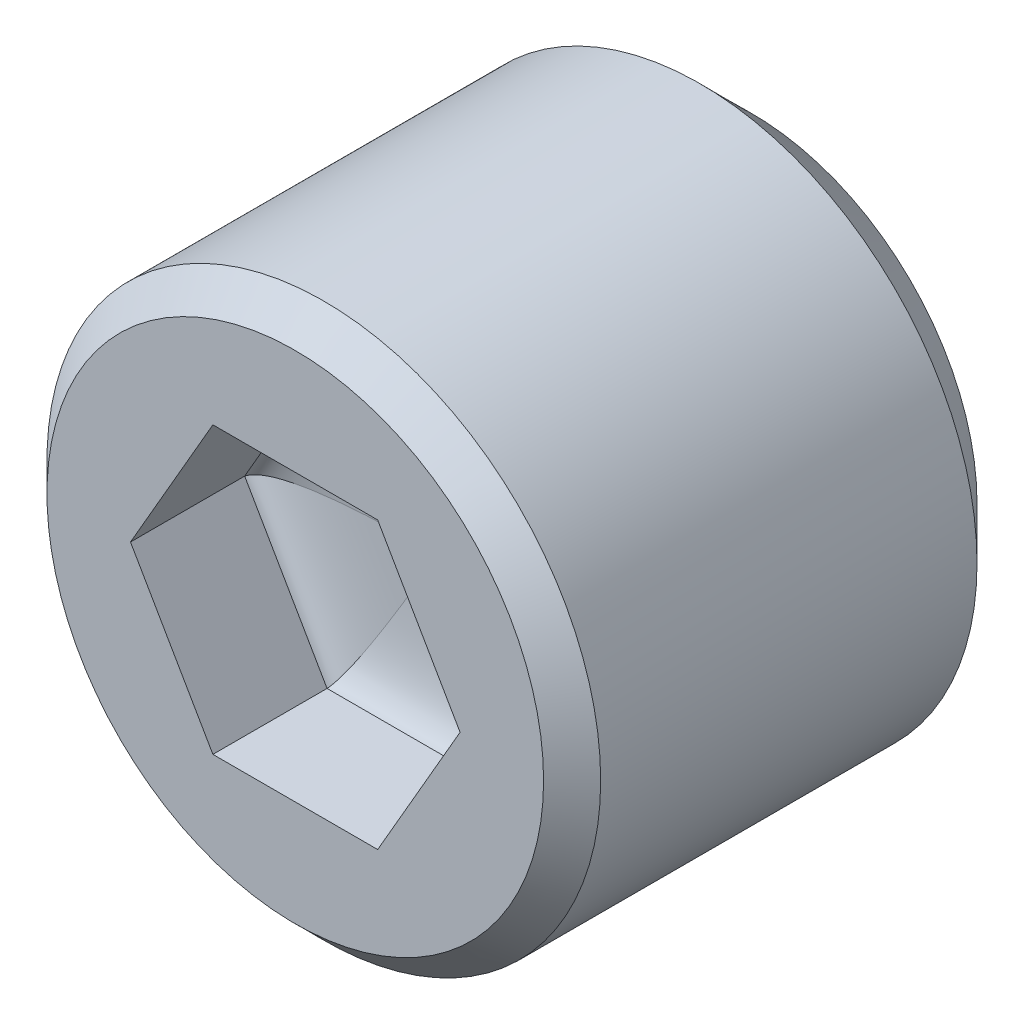
ISO-10303-21;
HEADER;
FILE_DESCRIPTION(('STEP AP214'),'2;1');
FILE_NAME('part.step','',(''),(''),'','','');
FILE_SCHEMA(('AUTOMOTIVE_DESIGN { 1 0 10303 214 1 1 1 1 }'));
ENDSEC;
DATA;
#1=APPLICATION_CONTEXT('core data for automotive mechanical design processes');
#2=APPLICATION_PROTOCOL_DEFINITION('international standard','automotive_design',2000,#1);
#3=PRODUCT_CONTEXT('',#1,'mechanical');
#4=PRODUCT('Part','Part','',(#3));
#5=PRODUCT_RELATED_PRODUCT_CATEGORY('part','',(#4));
#6=PRODUCT_DEFINITION_FORMATION('','',#4);
#7=PRODUCT_DEFINITION_CONTEXT('part definition',#1,'design');
#8=PRODUCT_DEFINITION('design','',#6,#7);
#9=PRODUCT_DEFINITION_SHAPE('','',#8);
#10=(LENGTH_UNIT() NAMED_UNIT(*) SI_UNIT(.MILLI.,.METRE.));
#11=(NAMED_UNIT(*) PLANE_ANGLE_UNIT() SI_UNIT($,.RADIAN.));
#12=(NAMED_UNIT(*) SI_UNIT($,.STERADIAN.) SOLID_ANGLE_UNIT());
#13=UNCERTAINTY_MEASURE_WITH_UNIT(LENGTH_MEASURE(1.E-05),#10,'distance_accuracy_value','');
#14=(GEOMETRIC_REPRESENTATION_CONTEXT(3) GLOBAL_UNCERTAINTY_ASSIGNED_CONTEXT((#13)) GLOBAL_UNIT_ASSIGNED_CONTEXT((#10,
#11,#12)) REPRESENTATION_CONTEXT('',''));
#15=CARTESIAN_POINT('',(0.,0.,0.));
#16=DIRECTION('',(0.,0.,1.));
#17=DIRECTION('',(1.,0.,0.));
#18=AXIS2_PLACEMENT_3D('',#15,#16,#17);
#19=CARTESIAN_POINT('',(0.,0.,4.));
#20=DIRECTION('',(0.,0.,-1.));
#21=DIRECTION('',(-1.,0.,0.));
#22=AXIS2_PLACEMENT_3D('',#19,#20,#21);
#23=CYLINDRICAL_SURFACE('',#22,4.85);
#24=CARTESIAN_POINT('',(0.,0.,3.5));
#25=DIRECTION('',(0.,0.,1.));
#26=DIRECTION('',(1.,0.,0.));
#27=AXIS2_PLACEMENT_3D('',#24,#25,#26);
#28=CIRCLE('',#27,4.85);
#29=CARTESIAN_POINT('',(4.85,0.,3.5));
#30=VERTEX_POINT('',#29);
#31=EDGE_CURVE('E11',#30,#30,#28,.F.);
#32=ORIENTED_EDGE('',*,*,#31,.T.);
#33=EDGE_LOOP('',(#32));
#34=FACE_BOUND('',#33,.T.);
#35=CARTESIAN_POINT('',(0.,0.,-3.09299999999998));
#36=DIRECTION('',(0.,0.,1.));
#37=DIRECTION('',(1.,0.,0.));
#38=AXIS2_PLACEMENT_3D('',#35,#36,#37);
#39=CIRCLE('',#38,4.85);
#40=CARTESIAN_POINT('',(4.85,0.,-3.09299999999998));
#41=VERTEX_POINT('',#40);
#42=EDGE_CURVE('E118',#41,#41,#39,.T.);
#43=ORIENTED_EDGE('',*,*,#42,.T.);
#44=EDGE_LOOP('',(#43));
#45=FACE_BOUND('',#44,.T.);
#46=ADVANCED_FACE('F43',(#34,#45),#23,.T.);
#47=CARTESIAN_POINT('',(0.,0.,4.));
#48=DIRECTION('',(0.,0.,1.));
#49=DIRECTION('',(1.,0.,0.));
#50=AXIS2_PLACEMENT_3D('',#47,#48,#49);
#51=PLANE('',#50);
#52=CARTESIAN_POINT('',(0.,0.,4.));
#53=DIRECTION('',(0.,0.,1.));
#54=DIRECTION('',(1.,0.,0.));
#55=AXIS2_PLACEMENT_3D('',#52,#53,#54);
#56=CIRCLE('',#55,4.34999999999999);
#57=CARTESIAN_POINT('',(4.34999999999999,0.,4.));
#58=VERTEX_POINT('',#57);
#59=EDGE_CURVE('E51',#58,#58,#56,.T.);
#60=ORIENTED_EDGE('',*,*,#59,.T.);
#61=EDGE_LOOP('',(#60));
#62=FACE_BOUND('',#61,.T.);
#63=DIRECTION('',(-0.5,0.866025403784439,0.));
#64=VECTOR('',#63,1.);
#65=CARTESIAN_POINT('',(2.88675134594813,0.,4.));
#66=LINE('',#65,#64);
#67=CARTESIAN_POINT('',(2.88675134594813,0.,4.));
#68=VERTEX_POINT('',#67);
#69=CARTESIAN_POINT('',(1.44337567297406,2.5,4.));
#70=VERTEX_POINT('',#69);
#71=EDGE_CURVE('E58',#68,#70,#66,.T.);
#72=ORIENTED_EDGE('',*,*,#71,.F.);
#73=DIRECTION('',(0.5,0.866025403784439,0.));
#74=VECTOR('',#73,1.);
#75=CARTESIAN_POINT('',(1.44337567297406,-2.5,4.));
#76=LINE('',#75,#74);
#77=CARTESIAN_POINT('',(1.44337567297406,-2.5,4.));
#78=VERTEX_POINT('',#77);
#79=EDGE_CURVE('E93',#78,#68,#76,.T.);
#80=ORIENTED_EDGE('',*,*,#79,.F.);
#81=DIRECTION('',(1.,0.,0.));
#82=VECTOR('',#81,1.);
#83=CARTESIAN_POINT('',(-1.44337567297406,-2.5,4.));
#84=LINE('',#83,#82);
#85=CARTESIAN_POINT('',(-1.44337567297406,-2.5,4.));
#86=VERTEX_POINT('',#85);
#87=EDGE_CURVE('E101',#86,#78,#84,.T.);
#88=ORIENTED_EDGE('',*,*,#87,.F.);
#89=DIRECTION('',(0.5,-0.866025403784439,0.));
#90=VECTOR('',#89,1.);
#91=CARTESIAN_POINT('',(-2.88675134594813,0.,4.));
#92=LINE('',#91,#90);
#93=CARTESIAN_POINT('',(-2.88675134594813,0.,4.));
#94=VERTEX_POINT('',#93);
#95=EDGE_CURVE('E107',#94,#86,#92,.T.);
#96=ORIENTED_EDGE('',*,*,#95,.F.);
#97=DIRECTION('',(-0.5,-0.866025403784439,0.));
#98=VECTOR('',#97,1.);
#99=CARTESIAN_POINT('',(-1.44337567297406,2.5,4.));
#100=LINE('',#99,#98);
#101=CARTESIAN_POINT('',(-1.44337567297406,2.5,4.));
#102=VERTEX_POINT('',#101);
#103=EDGE_CURVE('E376',#102,#94,#100,.T.);
#104=ORIENTED_EDGE('',*,*,#103,.F.);
#105=DIRECTION('',(-1.,0.,0.));
#106=VECTOR('',#105,1.);
#107=CARTESIAN_POINT('',(1.44337567297406,2.5,4.));
#108=LINE('',#107,#106);
#109=EDGE_CURVE('E359',#70,#102,#108,.T.);
#110=ORIENTED_EDGE('',*,*,#109,.F.);
#111=EDGE_LOOP('',(#72,#80,#88,#96,#104,#110));
#112=FACE_BOUND('',#111,.T.);
#113=ADVANCED_FACE('F109',(#62,#112),#51,.T.);
#114=CARTESIAN_POINT('',(0.,0.,-4.));
#115=DIRECTION('',(0.,0.,1.));
#116=DIRECTION('',(1.,0.,0.));
#117=AXIS2_PLACEMENT_3D('',#114,#115,#116);
#118=PLANE('',#117);
#119=CARTESIAN_POINT('',(0.,0.,-4.));
#120=DIRECTION('',(0.,0.,1.));
#121=DIRECTION('',(1.,0.,0.));
#122=AXIS2_PLACEMENT_3D('',#119,#120,#121);
#123=CIRCLE('',#122,3.94299999999999);
#124=CARTESIAN_POINT('',(3.94299999999999,0.,-4.));
#125=VERTEX_POINT('',#124);
#126=EDGE_CURVE('E129',#125,#125,#123,.F.);
#127=ORIENTED_EDGE('',*,*,#126,.T.);
#128=EDGE_LOOP('',(#127));
#129=FACE_BOUND('',#128,.T.);
#130=ADVANCED_FACE('F151',(#129),#118,.F.);
#131=CARTESIAN_POINT('',(0.,0.,-3.09299999999998));
#132=DIRECTION('',(0.,0.,1.));
#133=DIRECTION('',(1.,0.,0.));
#134=AXIS2_PLACEMENT_3D('',#131,#132,#133);
#135=CONICAL_SURFACE('',#134,4.85,0.785398163397444);
#136=ORIENTED_EDGE('',*,*,#126,.F.);
#137=EDGE_LOOP('',(#136));
#138=FACE_BOUND('',#137,.T.);
#139=ORIENTED_EDGE('',*,*,#42,.F.);
#140=EDGE_LOOP('',(#139));
#141=FACE_BOUND('',#140,.T.);
#142=ADVANCED_FACE('F155',(#138,#141),#135,.T.);
#143=CARTESIAN_POINT('',(2.88675134594813,0.,2.));
#144=DIRECTION('',(0.866025403784439,0.5,0.));
#145=DIRECTION('',(-0.5,0.866025403784439,0.));
#146=AXIS2_PLACEMENT_3D('',#143,#144,#145);
#147=PLANE('',#146);
#148=ORIENTED_EDGE('',*,*,#71,.T.);
#149=DIRECTION('',(0.,0.,1.));
#150=VECTOR('',#149,1.);
#151=CARTESIAN_POINT('',(1.44337567297406,2.5,2.));
#152=LINE('',#151,#150);
#153=CARTESIAN_POINT('',(1.44337567297406,2.5,2.));
#154=VERTEX_POINT('',#153);
#155=EDGE_CURVE('E125',#154,#70,#152,.T.);
#156=ORIENTED_EDGE('',*,*,#155,.F.);
#157=DIRECTION('',(-0.5,0.866025403784439,0.));
#158=VECTOR('',#157,1.);
#159=CARTESIAN_POINT('',(2.88675134594813,0.,2.));
#160=LINE('',#159,#158);
#161=CARTESIAN_POINT('',(2.88675134594813,0.,2.));
#162=VERTEX_POINT('',#161);
#163=EDGE_CURVE('E111',#162,#154,#160,.T.);
#164=ORIENTED_EDGE('',*,*,#163,.F.);
#165=DIRECTION('',(0.,0.,1.));
#166=VECTOR('',#165,1.);
#167=CARTESIAN_POINT('',(2.88675134594813,0.,2.));
#168=LINE('',#167,#166);
#169=EDGE_CURVE('E97',#162,#68,#168,.T.);
#170=ORIENTED_EDGE('',*,*,#169,.T.);
#171=EDGE_LOOP('',(#148,#156,#164,#170));
#172=FACE_BOUND('',#171,.T.);
#173=ADVANCED_FACE('F157',(#172),#147,.F.);
#174=CARTESIAN_POINT('',(1.44337567297406,-2.5,2.));
#175=DIRECTION('',(0.866025403784439,-0.5,0.));
#176=DIRECTION('',(0.5,0.866025403784439,0.));
#177=AXIS2_PLACEMENT_3D('',#174,#175,#176);
#178=PLANE('',#177);
#179=ORIENTED_EDGE('',*,*,#79,.T.);
#180=ORIENTED_EDGE('',*,*,#169,.F.);
#181=DIRECTION('',(0.5,0.866025403784439,0.));
#182=VECTOR('',#181,1.);
#183=CARTESIAN_POINT('',(1.44337567297406,-2.5,2.));
#184=LINE('',#183,#182);
#185=CARTESIAN_POINT('',(1.44337567297406,-2.5,2.));
#186=VERTEX_POINT('',#185);
#187=EDGE_CURVE('E95',#186,#162,#184,.T.);
#188=ORIENTED_EDGE('',*,*,#187,.F.);
#189=DIRECTION('',(0.,0.,1.));
#190=VECTOR('',#189,1.);
#191=CARTESIAN_POINT('',(1.44337567297406,-2.5,2.));
#192=LINE('',#191,#190);
#193=EDGE_CURVE('E88',#186,#78,#192,.T.);
#194=ORIENTED_EDGE('',*,*,#193,.T.);
#195=EDGE_LOOP('',(#179,#180,#188,#194));
#196=FACE_BOUND('',#195,.T.);
#197=ADVANCED_FACE('F90',(#196),#178,.F.);
#198=CARTESIAN_POINT('',(-1.44337567297406,-2.5,2.));
#199=DIRECTION('',(0.,-1.,0.));
#200=DIRECTION('',(1.,0.,0.));
#201=AXIS2_PLACEMENT_3D('',#198,#199,#200);
#202=PLANE('',#201);
#203=ORIENTED_EDGE('',*,*,#87,.T.);
#204=ORIENTED_EDGE('',*,*,#193,.F.);
#205=DIRECTION('',(1.,0.,0.));
#206=VECTOR('',#205,1.);
#207=CARTESIAN_POINT('',(-1.44337567297406,-2.5,2.));
#208=LINE('',#207,#206);
#209=CARTESIAN_POINT('',(-1.44337567297406,-2.5,2.));
#210=VERTEX_POINT('',#209);
#211=EDGE_CURVE('E67',#210,#186,#208,.T.);
#212=ORIENTED_EDGE('',*,*,#211,.F.);
#213=DIRECTION('',(0.,0.,1.));
#214=VECTOR('',#213,1.);
#215=CARTESIAN_POINT('',(-1.44337567297406,-2.5,2.));
#216=LINE('',#215,#214);
#217=EDGE_CURVE('E98',#210,#86,#216,.T.);
#218=ORIENTED_EDGE('',*,*,#217,.T.);
#219=EDGE_LOOP('',(#203,#204,#212,#218));
#220=FACE_BOUND('',#219,.T.);
#221=ADVANCED_FACE('F102',(#220),#202,.F.);
#222=CARTESIAN_POINT('',(-2.88675134594813,0.,2.));
#223=DIRECTION('',(-0.866025403784439,-0.5,0.));
#224=DIRECTION('',(0.5,-0.866025403784439,0.));
#225=AXIS2_PLACEMENT_3D('',#222,#223,#224);
#226=PLANE('',#225);
#227=ORIENTED_EDGE('',*,*,#95,.T.);
#228=ORIENTED_EDGE('',*,*,#217,.F.);
#229=DIRECTION('',(0.5,-0.866025403784439,0.));
#230=VECTOR('',#229,1.);
#231=CARTESIAN_POINT('',(-2.88675134594813,0.,2.));
#232=LINE('',#231,#230);
#233=CARTESIAN_POINT('',(-2.88675134594813,0.,2.));
#234=VERTEX_POINT('',#233);
#235=EDGE_CURVE('E366',#234,#210,#232,.T.);
#236=ORIENTED_EDGE('',*,*,#235,.F.);
#237=DIRECTION('',(0.,0.,1.));
#238=VECTOR('',#237,1.);
#239=CARTESIAN_POINT('',(-2.88675134594813,0.,2.));
#240=LINE('',#239,#238);
#241=EDGE_CURVE('E121',#234,#94,#240,.T.);
#242=ORIENTED_EDGE('',*,*,#241,.T.);
#243=EDGE_LOOP('',(#227,#228,#236,#242));
#244=FACE_BOUND('',#243,.T.);
#245=ADVANCED_FACE('F203',(#244),#226,.F.);
#246=CARTESIAN_POINT('',(-1.44337567297406,2.5,2.));
#247=DIRECTION('',(-0.866025403784439,0.5,0.));
#248=DIRECTION('',(-0.5,-0.866025403784439,0.));
#249=AXIS2_PLACEMENT_3D('',#246,#247,#248);
#250=PLANE('',#249);
#251=ORIENTED_EDGE('',*,*,#103,.T.);
#252=ORIENTED_EDGE('',*,*,#241,.F.);
#253=DIRECTION('',(-0.5,-0.866025403784439,0.));
#254=VECTOR('',#253,1.);
#255=CARTESIAN_POINT('',(-1.44337567297406,2.5,2.));
#256=LINE('',#255,#254);
#257=CARTESIAN_POINT('',(-1.44337567297406,2.5,2.));
#258=VERTEX_POINT('',#257);
#259=EDGE_CURVE('E355',#258,#234,#256,.T.);
#260=ORIENTED_EDGE('',*,*,#259,.F.);
#261=DIRECTION('',(0.,0.,1.));
#262=VECTOR('',#261,1.);
#263=CARTESIAN_POINT('',(-1.44337567297406,2.5,2.));
#264=LINE('',#263,#262);
#265=EDGE_CURVE('E123',#258,#102,#264,.T.);
#266=ORIENTED_EDGE('',*,*,#265,.T.);
#267=EDGE_LOOP('',(#251,#252,#260,#266));
#268=FACE_BOUND('',#267,.T.);
#269=ADVANCED_FACE('F212',(#268),#250,.F.);
#270=CARTESIAN_POINT('',(1.44337567297406,2.5,2.));
#271=DIRECTION('',(0.,1.,0.));
#272=DIRECTION('',(-1.,0.,0.));
#273=AXIS2_PLACEMENT_3D('',#270,#271,#272);
#274=PLANE('',#273);
#275=ORIENTED_EDGE('',*,*,#109,.T.);
#276=ORIENTED_EDGE('',*,*,#265,.F.);
#277=DIRECTION('',(-1.,0.,0.));
#278=VECTOR('',#277,1.);
#279=CARTESIAN_POINT('',(1.44337567297406,2.5,2.));
#280=LINE('',#279,#278);
#281=EDGE_CURVE('E114',#154,#258,#280,.T.);
#282=ORIENTED_EDGE('',*,*,#281,.F.);
#283=ORIENTED_EDGE('',*,*,#155,.T.);
#284=EDGE_LOOP('',(#275,#276,#282,#283));
#285=FACE_BOUND('',#284,.T.);
#286=ADVANCED_FACE('F222',(#285),#274,.F.);
#287=CARTESIAN_POINT('',(-1.44337567297406,-2.5,2.));
#288=CARTESIAN_POINT('',(-1.37120688932536,-2.375,1.5));
#289=CARTESIAN_POINT('',(0.,0.,1.5));
#290=CARTESIAN_POINT('',(1.44337567297406,-2.5,2.));
#291=CARTESIAN_POINT('',(1.37120688932536,-2.375,1.5));
#292=CARTESIAN_POINT('',(0.,0.,1.5));
#293=(BOUNDED_SURFACE() B_SPLINE_SURFACE(1,2,((#287,#288,#289),(#290,#291,#292)),.UNSPECIFIED.,
.F.,.F.,.F.) B_SPLINE_SURFACE_WITH_KNOTS((2,2),(3,3),(0.,1.),(0.,1.),
.UNSPECIFIED.) GEOMETRIC_REPRESENTATION_ITEM() RATIONAL_B_SPLINE_SURFACE(((1.,1.,1.),(1.,1.,1.))) REPRESENTATION_ITEM('') SURFACE());
#294=CARTESIAN_POINT('',(1.44337567297406,-2.5,2.));
#295=CARTESIAN_POINT('',(1.37120688932536,-2.375,1.5));
#296=CARTESIAN_POINT('',(0.,0.,1.5));
#297=(BOUNDED_CURVE() B_SPLINE_CURVE(2,(#294,#295,#296),.UNSPECIFIED.,.F.,
.F.) B_SPLINE_CURVE_WITH_KNOTS((3,3),(0.,1.),
.UNSPECIFIED.) CURVE() GEOMETRIC_REPRESENTATION_ITEM() RATIONAL_B_SPLINE_CURVE((1.,1.,1.)) REPRESENTATION_ITEM(''));
#298=CARTESIAN_POINT('',(0.,0.,1.5));
#299=VERTEX_POINT('',#298);
#300=EDGE_CURVE('E374',#186,#299,#297,.T.);
#301=CARTESIAN_POINT('',(-1.44337567297406,-2.5,2.));
#302=CARTESIAN_POINT('',(-1.37120688932536,-2.375,1.5));
#303=CARTESIAN_POINT('',(0.,0.,1.5));
#304=(BOUNDED_CURVE() B_SPLINE_CURVE(2,(#301,#302,#303),.UNSPECIFIED.,.F.,
.F.) B_SPLINE_CURVE_WITH_KNOTS((3,3),(0.,1.),
.UNSPECIFIED.) CURVE() GEOMETRIC_REPRESENTATION_ITEM() RATIONAL_B_SPLINE_CURVE((1.,1.,1.)) REPRESENTATION_ITEM(''));
#305=EDGE_CURVE('E381',#210,#299,#304,.T.);
#306=ORIENTED_EDGE('',*,*,#211,.T.);
#307=ORIENTED_EDGE('',*,*,#300,.T.);
#308=ORIENTED_EDGE('',*,*,#305,.F.);
#309=EDGE_LOOP('',(#306,#307,#308));
#310=FACE_BOUND('',#309,.T.);
#311=ADVANCED_FACE('F232',(#310),#293,.T.);
#312=CARTESIAN_POINT('',(-2.88675134594813,0.,2.));
#313=CARTESIAN_POINT('',(-2.74241377865072,0.,1.5));
#314=CARTESIAN_POINT('',(0.,0.,1.5));
#315=CARTESIAN_POINT('',(-1.44337567297406,-2.5,2.));
#316=CARTESIAN_POINT('',(-1.37120688932536,-2.375,1.5));
#317=CARTESIAN_POINT('',(0.,0.,1.5));
#318=(BOUNDED_SURFACE() B_SPLINE_SURFACE(1,2,((#312,#313,#314),(#315,#316,#317)),.UNSPECIFIED.,
.F.,.F.,.F.) B_SPLINE_SURFACE_WITH_KNOTS((2,2),(3,3),(0.,1.),(0.,1.),
.UNSPECIFIED.) GEOMETRIC_REPRESENTATION_ITEM() RATIONAL_B_SPLINE_SURFACE(((1.,1.,1.),(1.,1.,1.))) REPRESENTATION_ITEM('') SURFACE());
#319=CARTESIAN_POINT('',(-2.88675134594813,0.,2.));
#320=CARTESIAN_POINT('',(-2.74241377865072,0.,1.5));
#321=CARTESIAN_POINT('',(0.,0.,1.5));
#322=(BOUNDED_CURVE() B_SPLINE_CURVE(2,(#319,#320,#321),.UNSPECIFIED.,.F.,
.F.) B_SPLINE_CURVE_WITH_KNOTS((3,3),(0.,1.),
.UNSPECIFIED.) CURVE() GEOMETRIC_REPRESENTATION_ITEM() RATIONAL_B_SPLINE_CURVE((1.,1.,1.)) REPRESENTATION_ITEM(''));
#323=EDGE_CURVE('E382',#234,#299,#322,.T.);
#324=ORIENTED_EDGE('',*,*,#235,.T.);
#325=ORIENTED_EDGE('',*,*,#305,.T.);
#326=ORIENTED_EDGE('',*,*,#323,.F.);
#327=EDGE_LOOP('',(#324,#325,#326));
#328=FACE_BOUND('',#327,.T.);
#329=ADVANCED_FACE('F242',(#328),#318,.T.);
#330=CARTESIAN_POINT('',(-1.44337567297406,2.5,2.));
#331=CARTESIAN_POINT('',(-1.37120688932536,2.375,1.5));
#332=CARTESIAN_POINT('',(0.,0.,1.5));
#333=CARTESIAN_POINT('',(-2.88675134594813,0.,2.));
#334=CARTESIAN_POINT('',(-2.74241377865072,0.,1.5));
#335=CARTESIAN_POINT('',(0.,0.,1.5));
#336=(BOUNDED_SURFACE() B_SPLINE_SURFACE(1,2,((#330,#331,#332),(#333,#334,#335)),.UNSPECIFIED.,
.F.,.F.,.F.) B_SPLINE_SURFACE_WITH_KNOTS((2,2),(3,3),(0.,1.),(0.,1.),
.UNSPECIFIED.) GEOMETRIC_REPRESENTATION_ITEM() RATIONAL_B_SPLINE_SURFACE(((1.,1.,1.),(1.,1.,1.))) REPRESENTATION_ITEM('') SURFACE());
#337=CARTESIAN_POINT('',(-1.44337567297406,2.5,2.));
#338=CARTESIAN_POINT('',(-1.37120688932536,2.375,1.5));
#339=CARTESIAN_POINT('',(0.,0.,1.5));
#340=(BOUNDED_CURVE() B_SPLINE_CURVE(2,(#337,#338,#339),.UNSPECIFIED.,.F.,
.F.) B_SPLINE_CURVE_WITH_KNOTS((3,3),(0.,1.),
.UNSPECIFIED.) CURVE() GEOMETRIC_REPRESENTATION_ITEM() RATIONAL_B_SPLINE_CURVE((1.,1.,1.)) REPRESENTATION_ITEM(''));
#341=EDGE_CURVE('E349',#258,#299,#340,.T.);
#342=ORIENTED_EDGE('',*,*,#259,.T.);
#343=ORIENTED_EDGE('',*,*,#323,.T.);
#344=ORIENTED_EDGE('',*,*,#341,.F.);
#345=EDGE_LOOP('',(#342,#343,#344));
#346=FACE_BOUND('',#345,.T.);
#347=ADVANCED_FACE('F251',(#346),#336,.T.);
#348=CARTESIAN_POINT('',(1.44337567297406,-2.5,2.));
#349=CARTESIAN_POINT('',(1.37120688932536,-2.375,1.5));
#350=CARTESIAN_POINT('',(0.,0.,1.5));
#351=CARTESIAN_POINT('',(2.88675134594813,0.,2.));
#352=CARTESIAN_POINT('',(2.74241377865072,0.,1.5));
#353=CARTESIAN_POINT('',(0.,0.,1.5));
#354=(BOUNDED_SURFACE() B_SPLINE_SURFACE(1,2,((#348,#349,#350),(#351,#352,#353)),.UNSPECIFIED.,
.F.,.F.,.F.) B_SPLINE_SURFACE_WITH_KNOTS((2,2),(3,3),(0.,1.),(0.,1.),
.UNSPECIFIED.) GEOMETRIC_REPRESENTATION_ITEM() RATIONAL_B_SPLINE_SURFACE(((1.,1.,1.),(1.,1.,1.))) REPRESENTATION_ITEM('') SURFACE());
#355=CARTESIAN_POINT('',(2.88675134594813,0.,2.));
#356=CARTESIAN_POINT('',(2.74241377865072,0.,1.5));
#357=CARTESIAN_POINT('',(0.,0.,1.5));
#358=(BOUNDED_CURVE() B_SPLINE_CURVE(2,(#355,#356,#357),.UNSPECIFIED.,.F.,
.F.) B_SPLINE_CURVE_WITH_KNOTS((3,3),(0.,1.),
.UNSPECIFIED.) CURVE() GEOMETRIC_REPRESENTATION_ITEM() RATIONAL_B_SPLINE_CURVE((1.,1.,1.)) REPRESENTATION_ITEM(''));
#359=EDGE_CURVE('E388',#299,#162,#358,.F.);
#360=ORIENTED_EDGE('',*,*,#187,.T.);
#361=ORIENTED_EDGE('',*,*,#359,.F.);
#362=ORIENTED_EDGE('',*,*,#300,.F.);
#363=EDGE_LOOP('',(#360,#361,#362));
#364=FACE_BOUND('',#363,.T.);
#365=ADVANCED_FACE('F261',(#364),#354,.T.);
#366=CARTESIAN_POINT('',(1.44337567297406,2.5,2.));
#367=CARTESIAN_POINT('',(1.37120688932536,2.375,1.5));
#368=CARTESIAN_POINT('',(0.,0.,1.5));
#369=CARTESIAN_POINT('',(-1.44337567297406,2.5,2.));
#370=CARTESIAN_POINT('',(-1.37120688932536,2.375,1.5));
#371=CARTESIAN_POINT('',(0.,0.,1.5));
#372=(BOUNDED_SURFACE() B_SPLINE_SURFACE(1,2,((#366,#367,#368),(#369,#370,#371)),.UNSPECIFIED.,
.F.,.F.,.F.) B_SPLINE_SURFACE_WITH_KNOTS((2,2),(3,3),(0.,1.),(0.,1.),
.UNSPECIFIED.) GEOMETRIC_REPRESENTATION_ITEM() RATIONAL_B_SPLINE_SURFACE(((1.,1.,1.),(1.,1.,1.))) REPRESENTATION_ITEM('') SURFACE());
#373=CARTESIAN_POINT('',(1.44337567297406,2.5,2.));
#374=CARTESIAN_POINT('',(1.37120688932536,2.375,1.5));
#375=CARTESIAN_POINT('',(0.,0.,1.5));
#376=(BOUNDED_CURVE() B_SPLINE_CURVE(2,(#373,#374,#375),.UNSPECIFIED.,.F.,
.F.) B_SPLINE_CURVE_WITH_KNOTS((3,3),(0.,1.),
.UNSPECIFIED.) CURVE() GEOMETRIC_REPRESENTATION_ITEM() RATIONAL_B_SPLINE_CURVE((1.,1.,1.)) REPRESENTATION_ITEM(''));
#377=EDGE_CURVE('E352',#154,#299,#376,.T.);
#378=ORIENTED_EDGE('',*,*,#281,.T.);
#379=ORIENTED_EDGE('',*,*,#341,.T.);
#380=ORIENTED_EDGE('',*,*,#377,.F.);
#381=EDGE_LOOP('',(#378,#379,#380));
#382=FACE_BOUND('',#381,.T.);
#383=ADVANCED_FACE('F142',(#382),#372,.T.);
#384=CARTESIAN_POINT('',(2.88675134594813,0.,2.));
#385=CARTESIAN_POINT('',(2.74241377865072,0.,1.5));
#386=CARTESIAN_POINT('',(0.,0.,1.5));
#387=CARTESIAN_POINT('',(1.44337567297406,2.5,2.));
#388=CARTESIAN_POINT('',(1.37120688932536,2.375,1.5));
#389=CARTESIAN_POINT('',(0.,0.,1.5));
#390=(BOUNDED_SURFACE() B_SPLINE_SURFACE(1,2,((#384,#385,#386),(#387,#388,#389)),.UNSPECIFIED.,
.F.,.F.,.F.) B_SPLINE_SURFACE_WITH_KNOTS((2,2),(3,3),(0.,1.),(0.,1.),
.UNSPECIFIED.) GEOMETRIC_REPRESENTATION_ITEM() RATIONAL_B_SPLINE_SURFACE(((1.,1.,1.),(1.,1.,1.))) REPRESENTATION_ITEM('') SURFACE());
#391=ORIENTED_EDGE('',*,*,#163,.T.);
#392=ORIENTED_EDGE('',*,*,#377,.T.);
#393=ORIENTED_EDGE('',*,*,#359,.T.);
#394=EDGE_LOOP('',(#391,#392,#393));
#395=FACE_BOUND('',#394,.T.);
#396=ADVANCED_FACE('F136',(#395),#390,.T.);
#397=CARTESIAN_POINT('',(0.,0.,4.));
#398=DIRECTION('',(0.,0.,-1.));
#399=DIRECTION('',(-1.,0.,0.));
#400=AXIS2_PLACEMENT_3D('',#397,#398,#399);
#401=CONICAL_SURFACE('',#400,4.34999999999999,0.785398163397454);
#402=ORIENTED_EDGE('',*,*,#31,.F.);
#403=EDGE_LOOP('',(#402));
#404=FACE_BOUND('',#403,.T.);
#405=ORIENTED_EDGE('',*,*,#59,.F.);
#406=EDGE_LOOP('',(#405));
#407=FACE_BOUND('',#406,.T.);
#408=ADVANCED_FACE('F45',(#404,#407),#401,.T.);
#409=CLOSED_SHELL('',(#46,#113,#130,#142,#173,#197,#221,#245,#269,#286,#311,#329,#347,#365,#383,
#396,#408));
#410=MANIFOLD_SOLID_BREP('B2',#409);
#411=ADVANCED_BREP_SHAPE_REPRESENTATION('',(#18,#410),#14);
#412=SHAPE_DEFINITION_REPRESENTATION(#9,#411);
ENDSEC;
END-ISO-10303-21;
